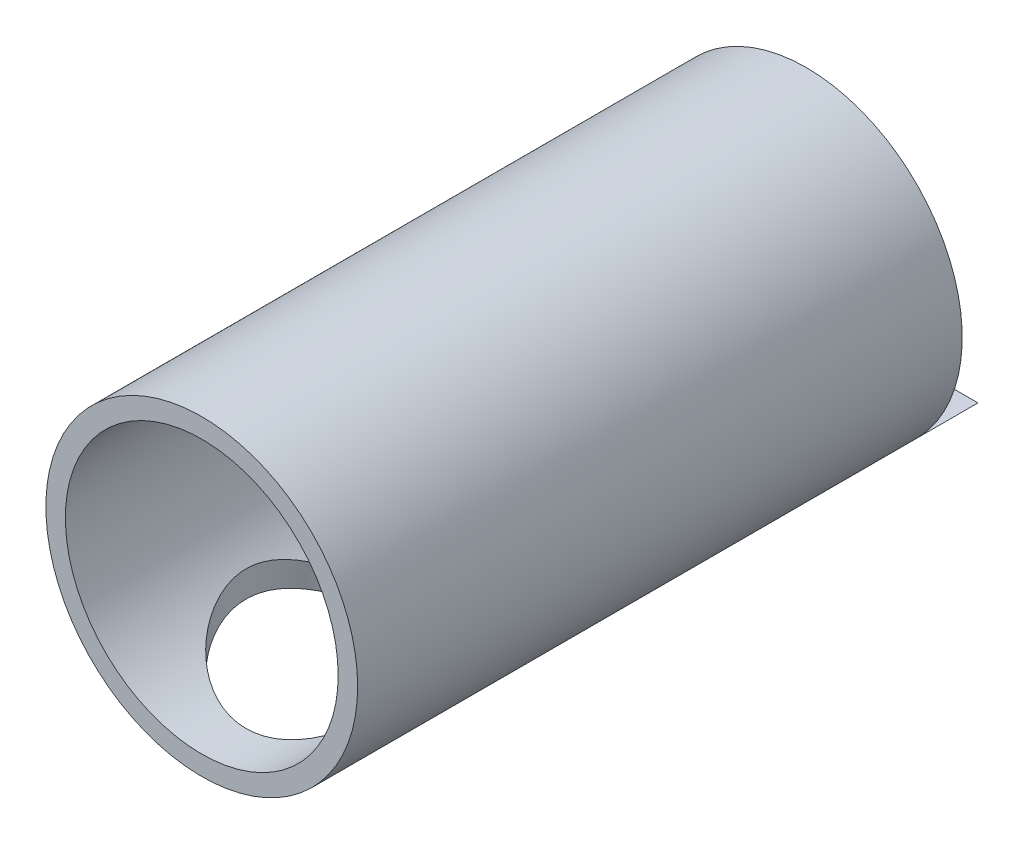
ISO-10303-21;
HEADER;
FILE_DESCRIPTION(('STEP AP214'),'2;1');
FILE_NAME('part.step','',(''),(''),'','','');
FILE_SCHEMA(('AUTOMOTIVE_DESIGN { 1 0 10303 214 1 1 1 1 }'));
ENDSEC;
DATA;
#1=APPLICATION_CONTEXT('core data for automotive mechanical design processes');
#2=APPLICATION_PROTOCOL_DEFINITION('international standard','automotive_design',2000,#1);
#3=PRODUCT_CONTEXT('',#1,'mechanical');
#4=PRODUCT('Part','Part','',(#3));
#5=PRODUCT_RELATED_PRODUCT_CATEGORY('part','',(#4));
#6=PRODUCT_DEFINITION_FORMATION('','',#4);
#7=PRODUCT_DEFINITION_CONTEXT('part definition',#1,'design');
#8=PRODUCT_DEFINITION('design','',#6,#7);
#9=PRODUCT_DEFINITION_SHAPE('','',#8);
#10=(LENGTH_UNIT() NAMED_UNIT(*) SI_UNIT(.MILLI.,.METRE.));
#11=(NAMED_UNIT(*) PLANE_ANGLE_UNIT() SI_UNIT($,.RADIAN.));
#12=(NAMED_UNIT(*) SI_UNIT($,.STERADIAN.) SOLID_ANGLE_UNIT());
#13=UNCERTAINTY_MEASURE_WITH_UNIT(LENGTH_MEASURE(1.E-05),#10,'distance_accuracy_value','');
#14=(GEOMETRIC_REPRESENTATION_CONTEXT(3) GLOBAL_UNCERTAINTY_ASSIGNED_CONTEXT((#13)) GLOBAL_UNIT_ASSIGNED_CONTEXT((#10,
#11,#12)) REPRESENTATION_CONTEXT('',''));
#15=CARTESIAN_POINT('',(0.,0.,0.));
#16=DIRECTION('',(0.,0.,1.));
#17=DIRECTION('',(1.,0.,0.));
#18=AXIS2_PLACEMENT_3D('',#15,#16,#17);
#19=CARTESIAN_POINT('',(0.,0.,914.4));
#20=DIRECTION('',(0.,0.,-1.));
#21=DIRECTION('',(-1.,0.,0.));
#22=AXIS2_PLACEMENT_3D('',#19,#20,#21);
#23=CYLINDRICAL_SURFACE('',#22,25.4);
#24=CARTESIAN_POINT('',(0.,-25.4,69.0674709503732));
#25=CARTESIAN_POINT('',(-0.403478085019111,-25.3999990543276,69.0674718803553));
#26=CARTESIAN_POINT('',(-0.806976901218811,-25.3903647538297,69.0828735452404));
#27=CARTESIAN_POINT('',(-1.61088611196684,-25.3520626467812,69.1442661813202));
#28=CARTESIAN_POINT('',(-2.01129508796472,-25.3233865694762,69.1902704447025));
#29=CARTESIAN_POINT('',(-2.80641966006919,-25.2476488666224,69.3123177349243));
#30=CARTESIAN_POINT('',(-3.20112462632465,-25.2005566036402,69.3884108203259));
#31=CARTESIAN_POINT('',(-3.98127093758065,-25.0891361172404,69.5695898485172));
#32=CARTESIAN_POINT('',(-4.36671316948776,-25.0248095512299,69.6746730033874));
#33=CARTESIAN_POINT('',(-5.12399665120196,-24.8807655940299,69.9119367509596));
#34=CARTESIAN_POINT('',(-5.49589617786829,-24.8011266138505,70.04397949497));
#35=CARTESIAN_POINT('',(-6.22605850684684,-24.6279718846133,70.3340432448318));
#36=CARTESIAN_POINT('',(-6.58432103025632,-24.5344558519347,70.4920647816477));
#37=CARTESIAN_POINT('',(-7.28541967242452,-24.3354765490663,70.8325411118495));
#38=CARTESIAN_POINT('',(-7.62826031997413,-24.230016818691,71.0149886688755));
#39=CARTESIAN_POINT('',(-8.29732114077184,-24.0091359013327,71.4029119797624));
#40=CARTESIAN_POINT('',(-8.62353923538641,-23.8937134733622,71.6083906034054));
#41=CARTESIAN_POINT('',(-9.28357809411227,-23.6454901272351,72.0582640071923));
#42=CARTESIAN_POINT('',(-9.61592891478028,-23.5120374030259,72.3044556994824));
#43=CARTESIAN_POINT('',(-10.2588627271728,-23.2387129352431,72.8205355310437));
#44=CARTESIAN_POINT('',(-10.5694447516698,-23.0988409069043,73.0904247220393));
#45=CARTESIAN_POINT('',(-11.1682830854388,-22.815331073432,73.6529163535466));
#46=CARTESIAN_POINT('',(-11.4565104711429,-22.6716887011865,73.9455472703044));
#47=CARTESIAN_POINT('',(-12.0093097597401,-22.383780233152,74.5520670532543));
#48=CARTESIAN_POINT('',(-12.2738809467561,-22.2395141186258,74.8659565622628));
#49=CARTESIAN_POINT('',(-12.8126705800414,-21.9340805837693,75.5579851267854));
#50=CARTESIAN_POINT('',(-13.0833325208904,-21.7732739864745,75.9390648522918));
#51=CARTESIAN_POINT('',(-13.591387428654,-21.4598072783502,76.7260682330019));
#52=CARTESIAN_POINT('',(-13.8287741644459,-21.3071486966252,77.1319965209608));
#53=CARTESIAN_POINT('',(-14.2680327230432,-21.0155336714143,77.9667374978659));
#54=CARTESIAN_POINT('',(-14.4699524038213,-20.8765588766117,78.3955183154498));
#55=CARTESIAN_POINT('',(-14.7446078291284,-20.6825798979252,79.0544494608615));
#56=CARTESIAN_POINT('',(-14.8314470821778,-20.6203405647611,79.2766928116794));
#57=CARTESIAN_POINT('',(-14.9954622407911,-20.5013748692907,79.7262465049346));
#58=CARTESIAN_POINT('',(-15.0726356766813,-20.4446499167667,79.9535581249389));
#59=CARTESIAN_POINT('',(-15.2516605413133,-20.3116863970837,80.523252977938));
#60=CARTESIAN_POINT('',(-15.3475388176332,-20.2391774786352,80.8684189748329));
#61=CARTESIAN_POINT('',(-15.5161970499572,-20.1101695834757,81.5672069636196));
#62=CARTESIAN_POINT('',(-15.5889826102596,-20.0536667226624,81.9208268814198));
#63=CARTESIAN_POINT('',(-15.7104456209953,-19.9586537842492,82.6341719947139));
#64=CARTESIAN_POINT('',(-15.7591511774141,-19.9201227330864,82.9938895632136));
#65=CARTESIAN_POINT('',(-15.8318333056931,-19.8624073453141,83.7173794829276));
#66=CARTESIAN_POINT('',(-15.8558095387139,-19.8432232737954,84.0811518896321));
#67=CARTESIAN_POINT('',(-15.8786636694612,-19.824940412479,84.8109601727529));
#68=CARTESIAN_POINT('',(-15.8774750496363,-19.8258948542274,85.1769994906108));
#69=CARTESIAN_POINT('',(-15.8498561975666,-19.8479813363983,85.9075056349778));
#70=CARTESIAN_POINT('',(-15.8234258348423,-19.8691134811233,86.2719724533486));
#71=CARTESIAN_POINT('',(-15.7457362161555,-19.9307358574424,86.9968292974728));
#72=CARTESIAN_POINT('',(-15.6944597792085,-19.9712394841052,87.3572163253296));
#73=CARTESIAN_POINT('',(-15.5678510319425,-20.0700882007667,88.071228326232));
#74=CARTESIAN_POINT('',(-15.4925181934637,-20.1284336824833,88.4248531506325));
#75=CARTESIAN_POINT('',(-15.3208164512379,-20.2594161709562,89.1152162163736));
#76=CARTESIAN_POINT('',(-15.2249760993544,-20.331690232632,89.4521558907912));
#77=CARTESIAN_POINT('',(-15.0122828289383,-20.4892378865461,90.1163118413241));
#78=CARTESIAN_POINT('',(-14.8954230708368,-20.5745157087387,90.4435249119655));
#79=CARTESIAN_POINT('',(-14.6417128690675,-20.7558315008656,91.0870213298488));
#80=CARTESIAN_POINT('',(-14.5048616249909,-20.8518699015904,91.4033042388472));
#81=CARTESIAN_POINT('',(-14.2121049280042,-21.0524954079813,92.024101691612));
#82=CARTESIAN_POINT('',(-14.0561985545304,-21.1570829265791,92.3286156658786));
#83=CARTESIAN_POINT('',(-13.69528687302,-21.3928454802926,92.9810343629222));
#84=CARTESIAN_POINT('',(-13.48655188937,-21.5253351482432,93.3264051027369));
#85=CARTESIAN_POINT('',(-13.0446385731572,-21.7959752271421,93.9986753478718));
#86=CARTESIAN_POINT('',(-12.8114635863029,-21.9341248616975,94.3255773720573));
#87=CARTESIAN_POINT('',(-12.321383488717,-22.213128710514,94.9604598083032));
#88=CARTESIAN_POINT('',(-12.0644541041027,-22.3539855721747,95.2684203175107));
#89=CARTESIAN_POINT('',(-11.527946798228,-22.63533115601,95.8641360297068));
#90=CARTESIAN_POINT('',(-11.2483674153174,-22.7758198538213,96.1518899264813));
#91=CARTESIAN_POINT('',(-10.6193526091659,-23.0766134134329,96.7519510611497));
#92=CARTESIAN_POINT('',(-10.2660075234127,-23.2363571812001,97.0604597069058));
#93=CARTESIAN_POINT('',(-9.53103177491887,-23.5473711335139,97.6466443684156));
#94=CARTESIAN_POINT('',(-9.14939775704596,-23.6986403092069,97.9243167171258));
#95=CARTESIAN_POINT('',(-8.35961107330333,-23.9886180498272,98.446415898767));
#96=CARTESIAN_POINT('',(-7.95146452555572,-24.1273294950586,98.6908503617961));
#97=CARTESIAN_POINT('',(-7.11075323262923,-24.3883339160849,99.1439054242511));
#98=CARTESIAN_POINT('',(-6.67819139250353,-24.5106288393742,99.3525302725967));
#99=CARTESIAN_POINT('',(-5.81539896295833,-24.7290991119842,99.7209946307006));
#100=CARTESIAN_POINT('',(-5.38630160040934,-24.8263276552442,99.8828588749664));
#101=CARTESIAN_POINT('',(-4.51184302134854,-25.0000381870484,100.169768270912));
#102=CARTESIAN_POINT('',(-4.06648210700644,-25.0765205608251,100.294814106272));
#103=CARTESIAN_POINT('',(-3.16383825105483,-25.2063042189978,100.505899947814));
#104=CARTESIAN_POINT('',(-2.706569985792,-25.2596327297238,100.591985771652));
#105=CARTESIAN_POINT('',(-1.78408128023094,-25.3414942463823,100.723777805323));
#106=CARTESIAN_POINT('',(-1.31886221218537,-25.3700314879136,100.769490912874));
#107=CARTESIAN_POINT('',(-0.454770194055526,-25.3990436445037,100.815948055833));
#108=CARTESIAN_POINT('',(-0.0563077829100211,-25.4030575433006,100.822363586239));
#109=CARTESIAN_POINT('',(0.739689525548334,-25.3923456877853,100.805222964972));
#110=CARTESIAN_POINT('',(1.13722452761714,-25.3776221639849,100.781670380718));
#111=CARTESIAN_POINT('',(1.92826555350538,-25.3298010656592,100.70493714975));
#112=CARTESIAN_POINT('',(2.32177182968893,-25.2967046492947,100.651758370564));
#113=CARTESIAN_POINT('',(3.10187996118998,-25.2129380068548,100.516509779985));
#114=CARTESIAN_POINT('',(3.48848169460726,-25.1622674708289,100.43443945904));
#115=CARTESIAN_POINT('',(4.23713009427464,-25.0468467337469,100.246243364421));
#116=CARTESIAN_POINT('',(4.59954490570246,-24.9827273984638,100.14118850201));
#117=CARTESIAN_POINT('',(5.31352033308898,-24.8406720998749,99.9065390388456));
#118=CARTESIAN_POINT('',(5.66508140303422,-24.7627367153839,99.7769454661116));
#119=CARTESIAN_POINT('',(6.35565826358263,-24.5945506685743,99.4944613102802));
#120=CARTESIAN_POINT('',(6.69467370693301,-24.5042996656931,99.3415700829212));
#121=CARTESIAN_POINT('',(7.35877616632362,-24.3131208588343,99.0137607626064));
#122=CARTESIAN_POINT('',(7.68386146511333,-24.212191743793,98.8388399643463));
#123=CARTESIAN_POINT('',(8.35097887563847,-23.990764923785,98.449528192117));
#124=CARTESIAN_POINT('',(8.6914123085464,-23.8693202715422,98.2329356003121));
#125=CARTESIAN_POINT('',(9.35275869086713,-23.6180242841109,97.7761406008796));
#126=CARTESIAN_POINT('',(9.67367055620703,-23.4881724828812,97.5359368840115));
#127=CARTESIAN_POINT('',(10.2952879502439,-23.2224333409189,97.0330726784554));
#128=CARTESIAN_POINT('',(10.5959733532113,-23.0865402058178,96.7703903966615));
#129=CARTESIAN_POINT('',(11.175952026542,-22.811425601633,96.223981727754));
#130=CARTESIAN_POINT('',(11.4552436089674,-22.6722038710632,95.940253683633));
#131=CARTESIAN_POINT('',(12.0305905268656,-22.372857049036,95.3101143541734));
#132=CARTESIAN_POINT('',(12.3231887079128,-22.2126328979492,94.9605842116992));
#133=CARTESIAN_POINT('',(12.8779946211034,-21.8956470371712,94.2366040324035));
#134=CARTESIAN_POINT('',(13.1401972115011,-21.7388859169093,93.8621497962153));
#135=CARTESIAN_POINT('',(13.6324770077654,-21.433604342413,93.0899071291034));
#136=CARTESIAN_POINT('',(13.8625779028562,-21.2850778607826,92.6921362157146));
#137=CARTESIAN_POINT('',(14.2891116368787,-21.0011181856032,91.8742523452608));
#138=CARTESIAN_POINT('',(14.4855379658299,-20.8656875259449,91.4541350887139));
#139=CARTESIAN_POINT('',(14.80501175451,-20.6398034617487,90.683795214079));
#140=CARTESIAN_POINT('',(14.9348097948085,-20.545872845805,90.3373816779857));
#141=CARTESIAN_POINT('',(15.1706897394332,-20.3723247903756,89.6332628703051));
#142=CARTESIAN_POINT('',(15.2767858844427,-20.2926987620043,89.2755645271567));
#143=CARTESIAN_POINT('',(15.464010159146,-20.1503903701908,88.5507852346633));
#144=CARTESIAN_POINT('',(15.5451654434877,-20.0876895883088,88.1837149642785));
#145=CARTESIAN_POINT('',(15.6815190797355,-19.9814278678433,87.4420172729773));
#146=CARTESIAN_POINT('',(15.7367175118506,-19.937866870116,87.0673898754169));
#147=CARTESIAN_POINT('',(15.8204944089426,-19.8714583715747,86.3111004191223));
#148=CARTESIAN_POINT('',(15.8489163785772,-19.8487326633141,85.9294101379132));
#149=CARTESIAN_POINT('',(15.8780658880861,-19.825422606054,85.1642899069591));
#150=CARTESIAN_POINT('',(15.878793550085,-19.8248381594172,84.7808599648929));
#151=CARTESIAN_POINT('',(15.8525378270945,-19.8458387824437,84.0154547948847));
#152=CARTESIAN_POINT('',(15.8255460233412,-19.8674305873246,83.6334800442782));
#153=CARTESIAN_POINT('',(15.74433049487,-19.9318520280648,82.8742741765922));
#154=CARTESIAN_POINT('',(15.6901071543575,-19.9746813642871,82.4970429926635));
#155=CARTESIAN_POINT('',(15.5607946437221,-20.0755520122944,81.7803530002141));
#156=CARTESIAN_POINT('',(15.4877482697532,-20.1320824631934,81.440307210194));
#157=CARTESIAN_POINT('',(15.3202937132004,-20.2598047074532,80.7682391039852));
#158=CARTESIAN_POINT('',(15.2258786936535,-20.3310011925997,80.4362193934787));
#159=CARTESIAN_POINT('',(15.0166498371282,-20.4860230504366,79.7816666957828));
#160=CARTESIAN_POINT('',(14.9018339119806,-20.5698497157766,79.4591346836654));
#161=CARTESIAN_POINT('',(14.6528185436187,-20.7479735356474,78.8247288949125));
#162=CARTESIAN_POINT('',(14.5186183829387,-20.8422710777052,78.5128555133118));
#163=CARTESIAN_POINT('',(14.0466562518148,-21.1662372883986,77.5056892412363));
#164=CARTESIAN_POINT('',(13.6693539326506,-21.4138169833401,76.8339818720441));
#165=CARTESIAN_POINT('',(13.037649308974,-21.8000238346084,75.8770430245573));
#166=CARTESIAN_POINT('',(12.8159497955886,-21.9313264679229,75.5663068385946));
#167=CARTESIAN_POINT('',(12.3512382709316,-22.1963592272427,74.9621078735639));
#168=CARTESIAN_POINT('',(12.1082246964933,-22.3300895307212,74.6686463640576));
#169=CARTESIAN_POINT('',(11.551456710608,-22.6239170088891,74.0434897419223));
#170=CARTESIAN_POINT('',(11.2332311644899,-22.7839832636912,73.7157550293325));
#171=CARTESIAN_POINT('',(10.5685366136962,-23.0998147673162,73.08790827291));
#172=CARTESIAN_POINT('',(10.2220639488703,-23.2555794552471,72.7877998195401));
#173=CARTESIAN_POINT('',(9.50193867035307,-23.5589879434892,72.2169045270051));
#174=CARTESIAN_POINT('',(9.12826701462072,-23.7066259247861,71.946138567117));
#175=CARTESIAN_POINT('',(8.3555459018551,-23.9898758956514,71.436373522217));
#176=CARTESIAN_POINT('',(7.95649853683644,-24.1254888743791,71.1973718235148));
#177=CARTESIAN_POINT('',(7.13424399250755,-24.3813095193128,70.7531470382594));
#178=CARTESIAN_POINT('',(6.71099387158867,-24.5014884937414,70.5479866669881));
#179=CARTESIAN_POINT('',(5.8435687608427,-24.7227225928009,70.1745572340112));
#180=CARTESIAN_POINT('',(5.39939045466987,-24.8237746737091,70.0062940431958));
#181=CARTESIAN_POINT('',(4.4950056880287,-25.0033356886847,69.7097329420289));
#182=CARTESIAN_POINT('',(4.03485302644359,-25.0819133522115,69.5813130816376));
#183=CARTESIAN_POINT('',(3.10169692893333,-25.2143057415009,69.3660763130142));
#184=CARTESIAN_POINT('',(2.62870324431315,-25.2681387301428,69.279228720283));
#185=CARTESIAN_POINT('',(1.79612303033696,-25.3389322210722,69.1653197022615));
#186=CARTESIAN_POINT('',(1.4383132491834,-25.3617902143661,69.1286674767965));
#187=CARTESIAN_POINT('',(0.720341248300809,-25.3923249957439,69.0797419312962));
#188=CARTESIAN_POINT('',(0.360178884351765,-25.4000008441877,69.067470120192));
#189=CARTESIAN_POINT('',(0.,-25.4,69.0674709503732));
#190=B_SPLINE_CURVE_WITH_KNOTS('',3,(#24,#25,#26,#27,#28,#29,#30,#31,#32,#33,#34,#35,#36,#37,
#38,#39,#40,#41,#42,#43,#44,#45,#46,#47,#48,#49,#50,#51,#52,#53,#54,#55,#56,#57,#58,#59,#60,#61,
#62,#63,#64,#65,#66,#67,#68,#69,#70,#71,#72,#73,#74,#75,#76,#77,#78,#79,#80,#81,#82,#83,#84,#85,
#86,#87,#88,#89,#90,#91,#92,#93,#94,#95,#96,#97,#98,#99,#100,#101,#102,#103,#104,#105,#106,#107,
#108,#109,#110,#111,#112,#113,#114,#115,#116,#117,#118,#119,#120,#121,#122,#123,#124,#125,#126,
#127,#128,#129,#130,#131,#132,#133,#134,#135,#136,#137,#138,#139,#140,#141,#142,#143,#144,#145,
#146,#147,#148,#149,#150,#151,#152,#153,#154,#155,#156,#157,#158,#159,#160,#161,#162,#163,#164,
#165,#166,#167,#168,#169,#170,#171,#172,#173,#174,#175,#176,#177,#178,#179,#180,#181,#182,#183,
#184,#185,#186,#187,#188,#189),.UNSPECIFIED.,.T.,.F.,(4,2,2,2,2,2,2,2,2,2,2,2,2,2,2,2,2,2,2,2,2,
2,2,2,2,2,2,2,2,2,2,2,2,2,2,2,2,2,2,2,2,2,2,2,2,2,2,2,2,2,2,2,2,2,2,2,2,2,2,2,2,2,2,2,2,2,2,2,2,
2,2,2,2,2,2,2,2,2,2,2,2,2,4),(0.,1.21006493393103,2.42065580102828,3.63326925125319,
4.84576612738783,6.05221195934292,7.25868245217372,8.4647963083287,9.6710606195256,
10.9735649227531,12.27612706199,13.5803473417056,14.8846070760038,16.3657225005488,
17.8471149096481,19.3264927626546,20.0660080620244,20.8057119281486,21.9010393246928,
22.9961006960052,24.089880885171,25.1836760610352,26.2803627951922,27.3770551983714,
28.4745070455893,29.5719829890864,30.6439989222017,31.7163643149969,32.7887726543756,
33.8612328228759,35.1342354935968,36.4070641239586,37.6812081055037,38.9554343757409,
40.4401935576437,41.9251291180267,43.4097232186271,44.8941410456778,46.2984751244036,
47.7027831244746,49.105435314793,50.507847814238,51.7019276850319,52.8958654252829,
54.0897279125608,55.2836114567749,56.4306233171826,57.5775871355951,58.7245826773286,
59.8717192115154,61.1345777843242,62.3975064223739,63.6616736588416,64.9259405335382,
66.3738366318764,67.8219773013237,69.2690436079065,70.7163893472353,71.8603395415966,
73.0036005628323,74.145612399331,75.2876207068769,76.4362628280201,77.5848998839521,
78.7338858991685,79.8828557039791,80.938878926872,81.995240506448,83.0517102740475,
84.1082191546189,86.525635671508,87.7359874136102,88.9464279968879,90.3969356329842,
91.8476315197825,93.2993529942888,94.7509549412965,96.205217509916,97.6597113057075,
99.1097083273275,100.558633449264,101.63877356585,102.718980531429),.UNSPECIFIED.);
#191=CARTESIAN_POINT('',(0.,-25.4,69.0674709503732));
#192=VERTEX_POINT('',#191);
#193=EDGE_CURVE('E114',#192,#192,#190,.T.);
#194=ORIENTED_EDGE('',*,*,#193,.T.);
#195=EDGE_LOOP('',(#194));
#196=FACE_BOUND('',#195,.T.);
#197=DIRECTION('',(0.,0.,1.));
#198=VECTOR('',#197,1.);
#199=CARTESIAN_POINT('',(18.4450831863128,-17.4625,0.));
#200=LINE('',#199,#198);
#201=CARTESIAN_POINT('',(18.4450831863128,-17.4625,0.));
#202=VERTEX_POINT('',#201);
#203=CARTESIAN_POINT('',(18.4450831863128,-17.4625,9.525));
#204=VERTEX_POINT('',#203);
#205=EDGE_CURVE('E73',#202,#204,#200,.T.);
#206=ORIENTED_EDGE('',*,*,#205,.T.);
#207=CARTESIAN_POINT('',(0.,0.,9.525));
#208=DIRECTION('',(0.,0.,-1.));
#209=DIRECTION('',(-1.,0.,0.));
#210=AXIS2_PLACEMENT_3D('',#207,#208,#209);
#211=CIRCLE('',#210,25.4);
#212=CARTESIAN_POINT('',(-18.4450831863128,-17.4625,9.525));
#213=VERTEX_POINT('',#212);
#214=EDGE_CURVE('E106',#213,#204,#211,.T.);
#215=ORIENTED_EDGE('',*,*,#214,.F.);
#216=DIRECTION('',(0.,0.,1.));
#217=VECTOR('',#216,1.);
#218=CARTESIAN_POINT('',(-18.4450831863128,-17.4625,0.));
#219=LINE('',#218,#217);
#220=CARTESIAN_POINT('',(-18.4450831863128,-17.4625,0.));
#221=VERTEX_POINT('',#220);
#222=EDGE_CURVE('E81',#221,#213,#219,.T.);
#223=ORIENTED_EDGE('',*,*,#222,.F.);
#224=CARTESIAN_POINT('',(0.,0.,0.));
#225=DIRECTION('',(0.,0.,1.));
#226=DIRECTION('',(1.,0.,0.));
#227=AXIS2_PLACEMENT_3D('',#224,#225,#226);
#228=CIRCLE('',#227,25.4);
#229=EDGE_CURVE('E87',#221,#202,#228,.T.);
#230=ORIENTED_EDGE('',*,*,#229,.T.);
#231=EDGE_LOOP('',(#206,#215,#223,#230));
#232=FACE_BOUND('',#231,.T.);
#233=CARTESIAN_POINT('',(0.,0.,108.030182010221));
#234=DIRECTION('',(0.,0.,1.));
#235=DIRECTION('',(1.,0.,0.));
#236=AXIS2_PLACEMENT_3D('',#233,#234,#235);
#237=CIRCLE('',#236,25.4);
#238=CARTESIAN_POINT('',(25.4,0.,108.030182010221));
#239=VERTEX_POINT('',#238);
#240=EDGE_CURVE('E108',#239,#239,#237,.T.);
#241=ORIENTED_EDGE('',*,*,#240,.F.);
#242=EDGE_LOOP('',(#241));
#243=FACE_BOUND('',#242,.T.);
#244=ADVANCED_FACE('F32',(#196,#232,#243),#23,.T.);
#245=CARTESIAN_POINT('',(0.,0.,914.4));
#246=DIRECTION('',(0.,0.,-1.));
#247=DIRECTION('',(-1.,0.,0.));
#248=AXIS2_PLACEMENT_3D('',#245,#246,#247);
#249=CYLINDRICAL_SURFACE('',#248,22.225);
#250=CARTESIAN_POINT('',(0.,-22.225,69.0674709503732));
#251=CARTESIAN_POINT('',(0.392850681906901,-22.2250006660962,69.0674702343262));
#252=CARTESIAN_POINT('',(0.785692872025158,-22.2145626330166,69.0820734675261));
#253=CARTESIAN_POINT('',(1.56811207361682,-22.1730719320079,69.1402390054845));
#254=CARTESIAN_POINT('',(1.95768918035417,-22.1420198676606,69.183800462342));
#255=CARTESIAN_POINT('',(2.73063278288181,-22.0600404614185,69.2991966376929));
#256=CARTESIAN_POINT('',(3.11399701259986,-22.009106030354,69.3710414408502));
#257=CARTESIAN_POINT('',(3.87159824590774,-21.8885471971897,69.5419137802309));
#258=CARTESIAN_POINT('',(4.24583505511335,-21.8189223974246,69.6409418948205));
#259=CARTESIAN_POINT('',(4.98090366436841,-21.6629105451479,69.8642403582763));
#260=CARTESIAN_POINT('',(5.34179415650251,-21.5766109012349,69.9883792304983));
#261=CARTESIAN_POINT('',(6.05024638237031,-21.3887694922934,70.2607074883808));
#262=CARTESIAN_POINT('',(6.3978082084069,-21.287227832842,70.4088967074521));
#263=CARTESIAN_POINT('',(7.0780745734286,-21.0708066264357,70.7277742319294));
#264=CARTESIAN_POINT('',(7.41078006668976,-20.9559279378778,70.8984610894393));
#265=CARTESIAN_POINT('',(8.06025371054026,-20.7148005639484,71.2608678537387));
#266=CARTESIAN_POINT('',(8.37701961456368,-20.5885502827932,71.4525907133514));
#267=CARTESIAN_POINT('',(9.02134941690293,-20.314996664453,71.8737302894494));
#268=CARTESIAN_POINT('',(9.34734079672669,-20.1668204278987,72.1049849729129));
#269=CARTESIAN_POINT('',(9.97855786068069,-19.8620709018169,72.589241553179));
#270=CARTESIAN_POINT('',(10.2837825367504,-19.7054972053173,72.8422445043419));
#271=CARTESIAN_POINT('',(10.8732786856315,-19.3864618222875,73.3690567650037));
#272=CARTESIAN_POINT('',(11.1575206722389,-19.2239923111348,73.6428942957838));
#273=CARTESIAN_POINT('',(11.7040902282054,-18.8962024291983,74.210042543225));
#274=CARTESIAN_POINT('',(11.9664163708978,-18.7308818736622,74.5033545253972));
#275=CARTESIAN_POINT('',(12.5148717383741,-18.3699546547412,75.1644095071836));
#276=CARTESIAN_POINT('',(12.7964983959181,-18.1743728688998,75.5359169733837));
#277=CARTESIAN_POINT('',(13.3272973305481,-17.7887999179959,76.3043637538651));
#278=CARTESIAN_POINT('',(13.5764607590403,-17.5988102880814,76.7013099582522));
#279=CARTESIAN_POINT('',(14.0404660664344,-17.230887569845,77.5194098745175));
#280=CARTESIAN_POINT('',(14.2553494752828,-17.0529400455192,77.9405334411306));
#281=CARTESIAN_POINT('',(14.6489550403686,-16.7160350719173,78.8065364592686));
#282=CARTESIAN_POINT('',(14.8276968200671,-16.5570673366803,79.2514028526337));
#283=CARTESIAN_POINT('',(15.0950897999953,-16.3128899373892,80.0168835404676));
#284=CARTESIAN_POINT('',(15.194240780601,-16.2203859212937,80.3315330514525));
#285=CARTESIAN_POINT('',(15.3735580348154,-16.0505324975159,80.9701591373417));
#286=CARTESIAN_POINT('',(15.4537301270175,-15.9731784463799,81.2941328193666));
#287=CARTESIAN_POINT('',(15.5939119992639,-15.8363550038485,81.9495427249821));
#288=CARTESIAN_POINT('',(15.6539571182204,-15.7768542850679,82.2809647669899));
#289=CARTESIAN_POINT('',(15.7530851812215,-15.6778781733738,82.9499257801833));
#290=CARTESIAN_POINT('',(15.792168136661,-15.6384027695746,83.2874647480437));
#291=CARTESIAN_POINT('',(15.8487982360251,-15.5810102195983,83.9684560885881));
#292=CARTESIAN_POINT('',(15.8662014844525,-15.5632371342288,84.3119327902922));
#293=CARTESIAN_POINT('',(15.8786221117563,-15.5505648670745,84.9997074046572));
#294=CARTESIAN_POINT('',(15.8736401831501,-15.5556649776747,85.3440052915844));
#295=CARTESIAN_POINT('',(15.8413894200475,-15.5885061824724,86.0307007975095));
#296=CARTESIAN_POINT('',(15.8141047452529,-15.6162633686072,86.3730968917075));
#297=CARTESIAN_POINT('',(15.7377981726822,-15.6931588920821,87.0530202756402));
#298=CARTESIAN_POINT('',(15.6887738106727,-15.742299653278,87.3905470089443));
#299=CARTESIAN_POINT('',(15.5622878983037,-15.8674101628234,88.101133435479));
#300=CARTESIAN_POINT('',(15.4819938672747,-15.9460050742962,88.4732249293131));
#301=CARTESIAN_POINT('',(15.2964435476861,-16.1240789651255,89.2059642296228));
#302=CARTESIAN_POINT('',(15.1911834373383,-16.2235611416205,89.5666102744452));
#303=CARTESIAN_POINT('',(14.9570442074699,-16.4396730805242,90.2755837777538));
#304=CARTESIAN_POINT('',(14.8281222403798,-16.5563338734529,90.6238874987912));
#305=CARTESIAN_POINT('',(14.5481769977467,-16.8028559110631,91.3066155378701));
#306=CARTESIAN_POINT('',(14.3971517864341,-16.9327183116176,91.641038636971));
#307=CARTESIAN_POINT('',(14.0240556789867,-17.2439063598631,92.3970046240414));
#308=CARTESIAN_POINT('',(13.7944730541936,-17.4287072383334,92.8134223843381));
#309=CARTESIAN_POINT('',(13.3012559409508,-17.8079777688462,93.6209596964317));
#310=CARTESIAN_POINT('',(13.0376118123711,-18.0024501485085,94.0120720390455));
#311=CARTESIAN_POINT('',(12.4774161867444,-18.3951575516152,94.7685266722305));
#312=CARTESIAN_POINT('',(12.1808377939751,-18.5933955390959,95.1338474960251));
#313=CARTESIAN_POINT('',(11.5559702432215,-18.9880685650995,95.8372615341623));
#314=CARTESIAN_POINT('',(11.2276843270826,-19.1845037856973,96.1753575255626));
#315=CARTESIAN_POINT('',(10.5367715726995,-19.5725726576967,96.8260499476749));
#316=CARTESIAN_POINT('',(10.1738348311204,-19.7641388625929,97.1383583594451));
#317=CARTESIAN_POINT('',(9.41740545811417,-20.1355579275471,97.7314950667637));
#318=CARTESIAN_POINT('',(9.02390979506755,-20.3154096221961,98.0123202322238));
#319=CARTESIAN_POINT('',(8.20844840883029,-20.6583421234397,98.5392362321123));
#320=CARTESIAN_POINT('',(7.78653926860953,-20.8214547190524,98.7853932485108));
#321=CARTESIAN_POINT('',(7.13371143515178,-21.0502738121674,99.1264793468106));
#322=CARTESIAN_POINT('',(6.91279567194731,-21.1238992714753,99.2354745623836));
#323=CARTESIAN_POINT('',(6.46452849455526,-21.2653646775588,99.4437323601388));
#324=CARTESIAN_POINT('',(6.23717548929704,-21.3332031770687,99.5429925085935));
#325=CARTESIAN_POINT('',(5.66402989788314,-21.4940942324149,99.7772773558869));
#326=CARTESIAN_POINT('',(5.31458762718836,-21.583293508146,99.9061133569639));
#327=CARTESIAN_POINT('',(4.60425302296491,-21.7459010396656,100.139715469766));
#328=CARTESIAN_POINT('',(4.2433631692981,-21.8193126890417,100.244486754589));
#329=CARTESIAN_POINT('',(3.51229800918463,-21.9488517666274,100.428638265439));
#330=CARTESIAN_POINT('',(3.14212767718897,-22.0049882490291,100.508031793201));
#331=CARTESIAN_POINT('',(2.39475851098458,-22.0988142099316,100.640393460156));
#332=CARTESIAN_POINT('',(2.01755948005371,-22.1365031713081,100.693360858568));
#333=CARTESIAN_POINT('',(1.25767603284775,-22.1926670638027,100.772197466774));
#334=CARTESIAN_POINT('',(0.874977896844851,-22.2110799400903,100.797979160491));
#335=CARTESIAN_POINT('',(0.108276877653791,-22.2280437016789,100.821734049475));
#336=CARTESIAN_POINT('',(-0.275726002714488,-22.2265946298793,100.819707304805));
#337=CARTESIAN_POINT('',(-1.04201843002621,-22.203868451535,100.787877134358));
#338=CARTESIAN_POINT('',(-1.42430781379149,-22.1825894952534,100.758071117322));
#339=CARTESIAN_POINT('',(-2.18416888869125,-22.1206992753082,100.671147536707));
#340=CARTESIAN_POINT('',(-2.56174066659692,-22.080088367757,100.614030476221));
#341=CARTESIAN_POINT('',(-3.29155266084324,-21.9828413786664,100.476708711911));
#342=CARTESIAN_POINT('',(-3.6441413386102,-21.9270635273382,100.397737294095));
#343=CARTESIAN_POINT('',(-4.34046273486671,-21.7999143900716,100.216809189035));
#344=CARTESIAN_POINT('',(-4.68419580493301,-21.7285437242538,100.114853415866));
#345=CARTESIAN_POINT('',(-5.36105754202541,-21.571518460512,99.8891088077854));
#346=CARTESIAN_POINT('',(-5.69418567709314,-21.4858631473903,99.7653188796739));
#347=CARTESIAN_POINT('',(-6.34840651031989,-21.301734044044,99.4971394820547));
#348=CARTESIAN_POINT('',(-6.66949763734801,-21.2032585879209,99.3527473351815));
#349=CARTESIAN_POINT('',(-7.32701099853535,-20.9856161057643,99.0306376060129));
#350=CARTESIAN_POINT('',(-7.66218067328956,-20.8653823539317,98.8510849753403));
#351=CARTESIAN_POINT('',(-8.31566471677316,-20.6136600252535,98.470528674992));
#352=CARTESIAN_POINT('',(-8.63397824532308,-20.4821708882466,98.2695239375582));
#353=CARTESIAN_POINT('',(-9.25310799099118,-20.2100230317495,97.8473573888594));
#354=CARTESIAN_POINT('',(-9.55391360121083,-20.0693588609113,97.6261835624858));
#355=CARTESIAN_POINT('',(-10.1372329778514,-19.7811272892801,97.1650074819393));
#356=CARTESIAN_POINT('',(-10.4197449849857,-19.633559226887,96.9250034217665));
#357=CARTESIAN_POINT('',(-11.0154565453373,-19.3066231462665,96.3821312577303));
#358=CARTESIAN_POINT('',(-11.3249545405923,-19.1263340029844,96.0757477456737));
#359=CARTESIAN_POINT('',(-11.9171209802587,-18.7630896597592,95.4394605773452));
#360=CARTESIAN_POINT('',(-12.1997848925027,-18.5801340154528,95.1095529643669));
#361=CARTESIAN_POINT('',(-12.7376704130936,-18.2155970263292,94.4270001413932));
#362=CARTESIAN_POINT('',(-12.9928764012401,-18.0340165178228,94.0743421697779));
#363=CARTESIAN_POINT('',(-13.4746918121133,-17.6769108420435,93.347142516933));
#364=CARTESIAN_POINT('',(-13.7013062731147,-17.5013846118843,92.9726047083389));
#365=CARTESIAN_POINT('',(-14.0918072154378,-17.1879091560964,92.261929972862));
#366=CARTESIAN_POINT('',(-14.2599711523699,-17.0483546752914,91.9288491554457));
#367=CARTESIAN_POINT('',(-14.573925767921,-16.7807583547868,91.2477776795625));
#368=CARTESIAN_POINT('',(-14.7197166473304,-16.6527164117704,90.899787154941));
#369=CARTESIAN_POINT('',(-14.9873483917696,-16.4122618399832,90.1901887588366));
#370=CARTESIAN_POINT('',(-15.1092306034929,-16.2998223293389,89.8286057079069));
#371=CARTESIAN_POINT('',(-15.3277654278366,-16.0944946502693,89.092473234808));
#372=CARTESIAN_POINT('',(-15.4244241305873,-16.0016017634288,88.7179269673458));
#373=CARTESIAN_POINT('',(-15.575342064756,-15.854598015009,88.0286643047379));
#374=CARTESIAN_POINT('',(-15.6341448862423,-15.7964865721826,87.7157933740059));
#375=CARTESIAN_POINT('',(-15.7330869753834,-15.6979457190058,87.0843560860276));
#376=CARTESIAN_POINT('',(-15.7732285591909,-15.6575141143466,86.7657904406842));
#377=CARTESIAN_POINT('',(-15.8341420083332,-15.5959117103407,86.1252495818312));
#378=CARTESIAN_POINT('',(-15.8549321532848,-15.5747227346219,85.8032778771545));
#379=CARTESIAN_POINT('',(-15.8768200034572,-15.5524102065051,85.1579562993853));
#380=CARTESIAN_POINT('',(-15.8779174127033,-15.5512869556877,84.8346064056521));
#381=CARTESIAN_POINT('',(-15.8603969562493,-15.5691548955657,84.1889987329216));
#382=CARTESIAN_POINT('',(-15.8417785953162,-15.588146591521,83.8667409815614));
#383=CARTESIAN_POINT('',(-15.7851781207633,-15.6454588508231,83.2256914958422));
#384=CARTESIAN_POINT('',(-15.7471960742462,-15.6837793471881,82.906899749476));
#385=CARTESIAN_POINT('',(-15.6524605855232,-15.7783258208176,82.2744199465785));
#386=CARTESIAN_POINT('',(-15.5956834790501,-15.8345743673894,81.9607388497812));
#387=CARTESIAN_POINT('',(-15.4642052728552,-15.9630011809053,81.3404495054543));
#388=CARTESIAN_POINT('',(-15.3894996266833,-16.0351834880759,81.0338430736229));
#389=CARTESIAN_POINT('',(-15.1948698762085,-16.2200540321065,80.3264218528615));
#390=CARTESIAN_POINT('',(-15.068200417274,-16.3381809183742,79.9288735174251));
#391=CARTESIAN_POINT('',(-14.7864326900206,-16.5936180303841,79.1503577574944));
#392=CARTESIAN_POINT('',(-14.6313243715577,-16.7309350337209,78.7693962537823));
#393=CARTESIAN_POINT('',(-14.2942564474527,-17.0198171702739,78.0245840875795));
#394=CARTESIAN_POINT('',(-14.1122630172721,-17.1714001632556,77.6607557522561));
#395=CARTESIAN_POINT('',(-13.7229790973841,-17.4840726577133,76.95127560663));
#396=CARTESIAN_POINT('',(-13.5156905171507,-17.6451614411451,76.6056224271409));
#397=CARTESIAN_POINT('',(-13.0709356659282,-17.9772172329408,75.9238037909778));
#398=CARTESIAN_POINT('',(-12.8328081238372,-18.1483333673427,75.5881429158299));
#399=CARTESIAN_POINT('',(-12.3317774057622,-18.4924381191836,74.936888470542));
#400=CARTESIAN_POINT('',(-12.0688741975643,-18.665426739057,74.6212949264949));
#401=CARTESIAN_POINT('',(-11.5188286592269,-19.0098008508183,74.010817187502));
#402=CARTESIAN_POINT('',(-11.2316786637552,-19.1811858165656,73.7159395960385));
#403=CARTESIAN_POINT('',(-10.6337612854009,-19.5190084444272,73.1480328239887));
#404=CARTESIAN_POINT('',(-10.3229915474972,-19.6854456109106,72.8750058276158));
#405=CARTESIAN_POINT('',(-9.6231178499938,-20.0380868852902,72.3072989851007));
#406=CARTESIAN_POINT('',(-9.22972190979792,-20.2227832223903,72.0169408547028));
#407=CARTESIAN_POINT('',(-8.41264032362546,-20.5761083658225,71.4708505404523));
#408=CARTESIAN_POINT('',(-7.98894966044846,-20.7447344998819,71.2151241124502));
#409=CARTESIAN_POINT('',(-7.113934453219,-21.0608320180743,70.7419572908687));
#410=CARTESIAN_POINT('',(-6.66264718314003,-21.2083310751658,70.5244667281117));
#411=CARTESIAN_POINT('',(-5.73504769620165,-21.4777282636985,70.1310437401769));
#412=CARTESIAN_POINT('',(-5.25874527437063,-21.5996363235802,69.9550951947859));
#413=CARTESIAN_POINT('',(-4.39202388403095,-21.7901893385649,69.6819116088193));
#414=CARTESIAN_POINT('',(-4.00563445275707,-21.8646520872757,69.5758770588836));
#415=CARTESIAN_POINT('',(-3.22278489090329,-21.9936704276795,69.3928481616077));
#416=CARTESIAN_POINT('',(-2.82632636318415,-22.0482291668326,69.3158492227446));
#417=CARTESIAN_POINT('',(-2.02669491625937,-22.1360518016912,69.1921794355254));
#418=CARTESIAN_POINT('',(-1.62352764809902,-22.1693327727909,69.1454842679593));
#419=CARTESIAN_POINT('',(-0.8135705474759,-22.2138065076323,69.0831304234389));
#420=CARTESIAN_POINT('',(-0.406780721395942,-22.2249993102848,69.0674716918104));
#421=CARTESIAN_POINT('',(0.,-22.225,69.0674709503732));
#422=B_SPLINE_CURVE_WITH_KNOTS('',3,(#250,#251,#252,#253,#254,#255,#256,#257,#258,#259,#260,
#261,#262,#263,#264,#265,#266,#267,#268,#269,#270,#271,#272,#273,#274,#275,#276,#277,#278,#279,
#280,#281,#282,#283,#284,#285,#286,#287,#288,#289,#290,#291,#292,#293,#294,#295,#296,#297,#298,
#299,#300,#301,#302,#303,#304,#305,#306,#307,#308,#309,#310,#311,#312,#313,#314,#315,#316,#317,
#318,#319,#320,#321,#322,#323,#324,#325,#326,#327,#328,#329,#330,#331,#332,#333,#334,#335,#336,
#337,#338,#339,#340,#341,#342,#343,#344,#345,#346,#347,#348,#349,#350,#351,#352,#353,#354,#355,
#356,#357,#358,#359,#360,#361,#362,#363,#364,#365,#366,#367,#368,#369,#370,#371,#372,#373,#374,
#375,#376,#377,#378,#379,#380,#381,#382,#383,#384,#385,#386,#387,#388,#389,#390,#391,#392,#393,
#394,#395,#396,#397,#398,#399,#400,#401,#402,#403,#404,#405,#406,#407,#408,#409,#410,#411,#412,
#413,#414,#415,#416,#417,#418,#419,#420,#421),.UNSPECIFIED.,.T.,.F.,(4,2,2,2,2,2,2,2,2,2,2,2,2,
2,2,2,2,2,2,2,2,2,2,2,2,2,2,2,2,2,2,2,2,2,2,2,2,2,2,2,2,2,2,2,2,2,2,2,2,2,2,2,2,2,2,2,2,2,2,2,2,
2,2,2,2,2,2,2,2,2,2,2,2,2,2,2,2,2,2,2,2,2,2,2,2,4),(0.,1.17813145847064,2.35622842259733,
3.53474582807175,4.71328831023865,5.88581279488861,7.05832915817469,8.23077009782892,
9.40337582406044,10.6809697290971,11.9586256071096,13.2380440355205,14.5175456860954,
16.0324935911347,17.5478535697362,19.0613635276514,20.5740494902836,21.6010673763819,
22.6277699878989,23.6526603564379,24.6775501678509,25.7092068866606,26.7408316899159,
27.7731898314641,28.8056650226252,29.9700201358555,31.1345536028324,32.3012170276912,
33.467982688425,34.9963894304239,36.5252296955512,38.055327797534,39.5852696242672,
41.1304735725987,42.6758310102946,44.2181971474131,44.9892408530349,45.760476827743,
46.9081212531228,48.0555187424912,49.2023138341667,50.3491410711745,51.4996490013065,
52.6501544464756,53.8007672218438,54.9513588026787,56.046984620269,57.1425668731434,
58.2382039956362,59.3339836317801,60.5291922902331,61.7244604668213,62.920445397772,
64.116545175692,65.5291495056087,66.941991995753,68.3556340175177,69.7690265844756,
70.9631619751735,72.1572866482943,73.3493276831135,74.5410806368237,75.5109276532634,
76.4806542642878,77.4494639267539,78.4182881500712,79.3871367095044,80.3559819115197,
81.326051625276,82.2963675968242,83.5953436303319,84.8947796030729,86.1958645618075,
87.4968513652552,88.8327996657601,90.1687497033224,91.5051236782092,92.841631072328,
94.4074393327399,95.9735075147093,97.5375052725422,99.1008951261658,100.321978111725,
101.542867921253,102.762776733654,103.982683397045),.UNSPECIFIED.);
#423=CARTESIAN_POINT('',(0.,-22.225,69.0674709503732));
#424=VERTEX_POINT('',#423);
#425=EDGE_CURVE('E121',#424,#424,#422,.T.);
#426=ORIENTED_EDGE('',*,*,#425,.T.);
#427=EDGE_LOOP('',(#426));
#428=FACE_BOUND('',#427,.T.);
#429=CARTESIAN_POINT('',(0.,0.,9.52500000000001));
#430=DIRECTION('',(0.,0.,-1.));
#431=DIRECTION('',(-1.,0.,0.));
#432=AXIS2_PLACEMENT_3D('',#429,#430,#431);
#433=CIRCLE('',#432,22.225);
#434=CARTESIAN_POINT('',(-13.748153285078,-17.4625,9.52500000000001));
#435=VERTEX_POINT('',#434);
#436=CARTESIAN_POINT('',(13.748153285078,-17.4625,9.52500000000001));
#437=VERTEX_POINT('',#436);
#438=EDGE_CURVE('E94',#435,#437,#433,.T.);
#439=ORIENTED_EDGE('',*,*,#438,.T.);
#440=DIRECTION('',(0.,0.,-1.));
#441=VECTOR('',#440,1.);
#442=CARTESIAN_POINT('',(13.748153285078,-17.4625,914.4));
#443=LINE('',#442,#441);
#444=CARTESIAN_POINT('',(13.748153285078,-17.4625,0.));
#445=VERTEX_POINT('',#444);
#446=EDGE_CURVE('E11',#437,#445,#443,.T.);
#447=ORIENTED_EDGE('',*,*,#446,.T.);
#448=CARTESIAN_POINT('',(0.,0.,0.));
#449=DIRECTION('',(0.,0.,1.));
#450=DIRECTION('',(1.,0.,0.));
#451=AXIS2_PLACEMENT_3D('',#448,#449,#450);
#452=CIRCLE('',#451,22.225);
#453=CARTESIAN_POINT('',(-13.748153285078,-17.4625,0.));
#454=VERTEX_POINT('',#453);
#455=EDGE_CURVE('E80',#454,#445,#452,.T.);
#456=ORIENTED_EDGE('',*,*,#455,.F.);
#457=DIRECTION('',(0.,0.,-1.));
#458=VECTOR('',#457,1.);
#459=CARTESIAN_POINT('',(-13.748153285078,-17.4625,914.4));
#460=LINE('',#459,#458);
#461=EDGE_CURVE('E41',#454,#435,#460,.F.);
#462=ORIENTED_EDGE('',*,*,#461,.T.);
#463=EDGE_LOOP('',(#439,#447,#456,#462));
#464=FACE_BOUND('',#463,.T.);
#465=CARTESIAN_POINT('',(0.,0.,108.030182010221));
#466=DIRECTION('',(0.,0.,1.));
#467=DIRECTION('',(1.,0.,0.));
#468=AXIS2_PLACEMENT_3D('',#465,#466,#467);
#469=CIRCLE('',#468,22.225);
#470=CARTESIAN_POINT('',(22.225,0.,108.030182010221));
#471=VERTEX_POINT('',#470);
#472=EDGE_CURVE('E36',#471,#471,#469,.T.);
#473=ORIENTED_EDGE('',*,*,#472,.T.);
#474=EDGE_LOOP('',(#473));
#475=FACE_BOUND('',#474,.T.);
#476=ADVANCED_FACE('F101',(#428,#464,#475),#249,.F.);
#477=CARTESIAN_POINT('',(0.,0.,0.));
#478=DIRECTION('',(0.,0.,1.));
#479=DIRECTION('',(1.,0.,0.));
#480=AXIS2_PLACEMENT_3D('',#477,#478,#479);
#481=PLANE('',#480);
#482=DIRECTION('',(-1.,0.,0.));
#483=VECTOR('',#482,1.);
#484=CARTESIAN_POINT('',(18.4450831863128,-17.4625,0.));
#485=LINE('',#484,#483);
#486=EDGE_CURVE('E76',#202,#445,#485,.T.);
#487=ORIENTED_EDGE('',*,*,#486,.F.);
#488=ORIENTED_EDGE('',*,*,#229,.F.);
#489=EDGE_CURVE('E89',#454,#221,#485,.T.);
#490=ORIENTED_EDGE('',*,*,#489,.F.);
#491=ORIENTED_EDGE('',*,*,#455,.T.);
#492=EDGE_LOOP('',(#487,#488,#490,#491));
#493=FACE_BOUND('',#492,.T.);
#494=ADVANCED_FACE('F86',(#493),#481,.F.);
#495=CARTESIAN_POINT('',(18.4450831863128,-17.4625,0.));
#496=DIRECTION('',(0.,1.,0.));
#497=DIRECTION('',(0.,0.,1.));
#498=AXIS2_PLACEMENT_3D('',#495,#496,#497);
#499=PLANE('',#498);
#500=DIRECTION('',(-1.,0.,0.));
#501=VECTOR('',#500,1.);
#502=CARTESIAN_POINT('',(18.4450831863128,-17.4625,9.525));
#503=LINE('',#502,#501);
#504=EDGE_CURVE('E48',#204,#437,#503,.T.);
#505=ORIENTED_EDGE('',*,*,#504,.F.);
#506=ORIENTED_EDGE('',*,*,#205,.F.);
#507=ORIENTED_EDGE('',*,*,#486,.T.);
#508=ORIENTED_EDGE('',*,*,#446,.F.);
#509=EDGE_LOOP('',(#505,#506,#507,#508));
#510=FACE_BOUND('',#509,.T.);
#511=ADVANCED_FACE('F75',(#510),#499,.T.);
#512=ORIENTED_EDGE('',*,*,#489,.T.);
#513=ORIENTED_EDGE('',*,*,#222,.T.);
#514=EDGE_CURVE('E104',#435,#213,#503,.T.);
#515=ORIENTED_EDGE('',*,*,#514,.F.);
#516=ORIENTED_EDGE('',*,*,#461,.F.);
#517=EDGE_LOOP('',(#512,#513,#515,#516));
#518=FACE_BOUND('',#517,.T.);
#519=ADVANCED_FACE('F105',(#518),#499,.T.);
#520=CARTESIAN_POINT('',(0.,0.,9.525));
#521=DIRECTION('',(0.,0.,-1.));
#522=DIRECTION('',(-1.,0.,0.));
#523=AXIS2_PLACEMENT_3D('',#520,#521,#522);
#524=PLANE('',#523);
#525=ORIENTED_EDGE('',*,*,#514,.T.);
#526=ORIENTED_EDGE('',*,*,#214,.T.);
#527=ORIENTED_EDGE('',*,*,#504,.T.);
#528=ORIENTED_EDGE('',*,*,#438,.F.);
#529=EDGE_LOOP('',(#525,#526,#527,#528));
#530=FACE_BOUND('',#529,.T.);
#531=ADVANCED_FACE('F103',(#530),#524,.T.);
#532=CARTESIAN_POINT('',(-25.4,-25.4,108.030182010221));
#533=DIRECTION('',(0.,0.,1.));
#534=DIRECTION('',(1.,0.,0.));
#535=AXIS2_PLACEMENT_3D('',#532,#533,#534);
#536=PLANE('',#535);
#537=ORIENTED_EDGE('',*,*,#472,.F.);
#538=EDGE_LOOP('',(#537));
#539=FACE_BOUND('',#538,.T.);
#540=ORIENTED_EDGE('',*,*,#240,.T.);
#541=EDGE_LOOP('',(#540));
#542=FACE_BOUND('',#541,.T.);
#543=ADVANCED_FACE('F130',(#539,#542),#536,.T.);
#544=CARTESIAN_POINT('',(0.,25.401,84.9424709503732));
#545=DIRECTION('',(0.,-1.,0.));
#546=DIRECTION('',(0.,0.,-1.));
#547=AXIS2_PLACEMENT_3D('',#544,#545,#546);
#548=CYLINDRICAL_SURFACE('',#547,15.875);
#549=ORIENTED_EDGE('',*,*,#425,.F.);
#550=EDGE_LOOP('',(#549));
#551=FACE_BOUND('',#550,.T.);
#552=ORIENTED_EDGE('',*,*,#193,.F.);
#553=EDGE_LOOP('',(#552));
#554=FACE_BOUND('',#553,.T.);
#555=ADVANCED_FACE('F126',(#551,#554),#548,.F.);
#556=CLOSED_SHELL('',(#244,#476,#494,#511,#519,#531,#543,#555));
#557=MANIFOLD_SOLID_BREP('B2',#556);
#558=ADVANCED_BREP_SHAPE_REPRESENTATION('',(#18,#557),#14);
#559=SHAPE_DEFINITION_REPRESENTATION(#9,#558);
ENDSEC;
END-ISO-10303-21;
